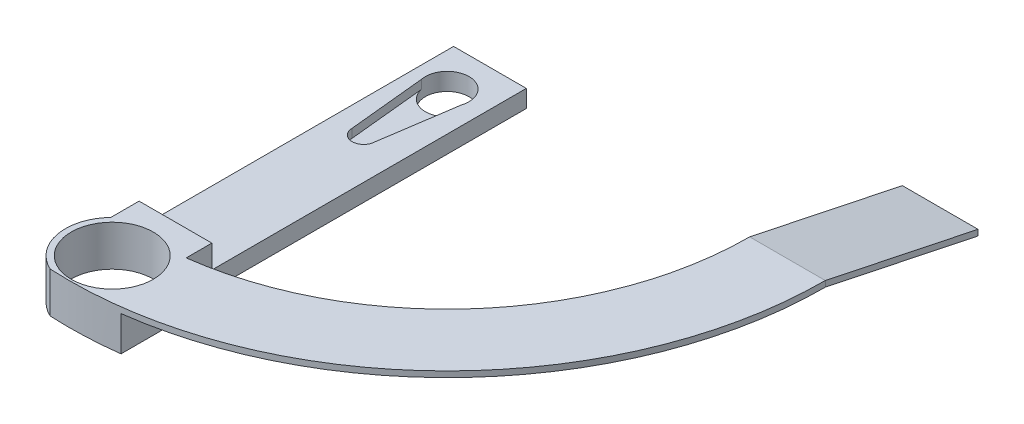
ISO-10303-21;
HEADER;
FILE_DESCRIPTION(('STEP AP214'),'2;1');
FILE_NAME('part.step','',(''),(''),'','','');
FILE_SCHEMA(('AUTOMOTIVE_DESIGN { 1 0 10303 214 1 1 1 1 }'));
ENDSEC;
DATA;
#1=APPLICATION_CONTEXT('core data for automotive mechanical design processes');
#2=APPLICATION_PROTOCOL_DEFINITION('international standard','automotive_design',2000,#1);
#3=PRODUCT_CONTEXT('',#1,'mechanical');
#4=PRODUCT('Part','Part','',(#3));
#5=PRODUCT_RELATED_PRODUCT_CATEGORY('part','',(#4));
#6=PRODUCT_DEFINITION_FORMATION('','',#4);
#7=PRODUCT_DEFINITION_CONTEXT('part definition',#1,'design');
#8=PRODUCT_DEFINITION('design','',#6,#7);
#9=PRODUCT_DEFINITION_SHAPE('','',#8);
#10=(LENGTH_UNIT() NAMED_UNIT(*) SI_UNIT(.MILLI.,.METRE.));
#11=(NAMED_UNIT(*) PLANE_ANGLE_UNIT() SI_UNIT($,.RADIAN.));
#12=(NAMED_UNIT(*) SI_UNIT($,.STERADIAN.) SOLID_ANGLE_UNIT());
#13=UNCERTAINTY_MEASURE_WITH_UNIT(LENGTH_MEASURE(1.E-05),#10,'distance_accuracy_value','');
#14=(GEOMETRIC_REPRESENTATION_CONTEXT(3) GLOBAL_UNCERTAINTY_ASSIGNED_CONTEXT((#13)) GLOBAL_UNIT_ASSIGNED_CONTEXT((#10,
#11,#12)) REPRESENTATION_CONTEXT('',''));
#15=CARTESIAN_POINT('',(0.,0.,0.));
#16=DIRECTION('',(0.,0.,1.));
#17=DIRECTION('',(1.,0.,0.));
#18=AXIS2_PLACEMENT_3D('',#15,#16,#17);
#19=CARTESIAN_POINT('',(0.,3.,0.));
#20=DIRECTION('',(0.,-1.,0.));
#21=DIRECTION('',(0.,0.,-1.));
#22=AXIS2_PLACEMENT_3D('',#19,#20,#21);
#23=PLANE('',#22);
#24=DIRECTION('',(-1.,0.,0.));
#25=VECTOR('',#24,1.);
#26=CARTESIAN_POINT('',(-5.81496405888249,3.,47.1607347172189));
#27=LINE('',#26,#25);
#28=CARTESIAN_POINT('',(6.6930693069307,3.,47.1607347172189));
#29=VERTEX_POINT('',#28);
#30=CARTESIAN_POINT('',(-5.81496405888249,3.,47.1607347172189));
#31=VERTEX_POINT('',#30);
#32=EDGE_CURVE('E217',#29,#31,#27,.T.);
#33=ORIENTED_EDGE('',*,*,#32,.F.);
#34=DIRECTION('',(0.,0.,-1.));
#35=VECTOR('',#34,1.);
#36=CARTESIAN_POINT('',(6.69306930693069,3.,-3.9115659850475));
#37=LINE('',#36,#35);
#38=CARTESIAN_POINT('',(6.69306930693069,3.,-6.9115659850475));
#39=VERTEX_POINT('',#38);
#40=EDGE_CURVE('E245',#29,#39,#37,.T.);
#41=ORIENTED_EDGE('',*,*,#40,.T.);
#42=DIRECTION('',(-1.,0.,0.));
#43=VECTOR('',#42,1.);
#44=CARTESIAN_POINT('',(6.69306930693069,3.,-6.9115659850475));
#45=LINE('',#44,#43);
#46=CARTESIAN_POINT('',(-5.8149640588825,3.,-6.9115659850475));
#47=VERTEX_POINT('',#46);
#48=EDGE_CURVE('E247',#39,#47,#45,.T.);
#49=ORIENTED_EDGE('',*,*,#48,.T.);
#50=DIRECTION('',(0.,0.,1.));
#51=VECTOR('',#50,1.);
#52=CARTESIAN_POINT('',(-5.8149640588825,3.,-6.9115659850475));
#53=LINE('',#52,#51);
#54=EDGE_CURVE('E250',#47,#31,#53,.T.);
#55=ORIENTED_EDGE('',*,*,#54,.T.);
#56=EDGE_LOOP('',(#33,#41,#49,#55));
#57=FACE_BOUND('',#56,.T.);
#58=DIRECTION('',(-0.148340452930244,0.,0.988936352868298));
#59=VECTOR('',#58,1.);
#60=CARTESIAN_POINT('',(3.75,3.,0.));
#61=LINE('',#60,#59);
#62=CARTESIAN_POINT('',(3.58496332518337,3.,1.1002444987775));
#63=VERTEX_POINT('',#62);
#64=CARTESIAN_POINT('',(1.65,3.,14.));
#65=VERTEX_POINT('',#64);
#66=EDGE_CURVE('E184',#63,#65,#61,.T.);
#67=ORIENTED_EDGE('',*,*,#66,.T.);
#68=CARTESIAN_POINT('',(-0.35,3.,14.));
#69=DIRECTION('',(0.,-1.,0.));
#70=DIRECTION('',(0.,0.,-1.));
#71=AXIS2_PLACEMENT_3D('',#68,#69,#70);
#72=CIRCLE('',#71,2.);
#73=CARTESIAN_POINT('',(-2.35,3.,14.));
#74=VERTEX_POINT('',#73);
#75=EDGE_CURVE('E201',#65,#74,#72,.T.);
#76=ORIENTED_EDGE('',*,*,#75,.T.);
#77=DIRECTION('',(-0.0995037190209987,0.,-0.995037190209989));
#78=VECTOR('',#77,1.);
#79=CARTESIAN_POINT('',(-3.75,3.,0.));
#80=LINE('',#79,#78);
#81=CARTESIAN_POINT('',(-3.67574257425743,3.,0.742574257425743));
#82=VERTEX_POINT('',#81);
#83=EDGE_CURVE('E193',#74,#82,#80,.T.);
#84=ORIENTED_EDGE('',*,*,#83,.T.);
#85=CARTESIAN_POINT('',(0.,3.,0.));
#86=DIRECTION('',(0.,1.,0.));
#87=DIRECTION('',(0.,0.,1.));
#88=AXIS2_PLACEMENT_3D('',#85,#86,#87);
#89=CIRCLE('',#88,3.75);
#90=EDGE_CURVE('E209',#63,#82,#89,.T.);
#91=ORIENTED_EDGE('',*,*,#90,.F.);
#92=EDGE_LOOP('',(#67,#76,#84,#91));
#93=FACE_BOUND('',#92,.T.);
#94=ADVANCED_FACE('F33',(#57,#93),#23,.F.);
#95=CARTESIAN_POINT('',(0.,0.,0.));
#96=DIRECTION('',(0.,-1.,0.));
#97=DIRECTION('',(0.,0.,-1.));
#98=AXIS2_PLACEMENT_3D('',#95,#96,#97);
#99=PLANE('',#98);
#100=DIRECTION('',(0.,0.,-1.));
#101=VECTOR('',#100,1.);
#102=CARTESIAN_POINT('',(8.38386432988614,0.,71.0017380547132));
#103=LINE('',#102,#101);
#104=CARTESIAN_POINT('',(8.38386432988614,0.,64.4570463091357));
#105=VERTEX_POINT('',#104);
#106=CARTESIAN_POINT('',(8.38386432988614,0.,51.3196923110229));
#107=VERTEX_POINT('',#106);
#108=EDGE_CURVE('E349',#105,#107,#103,.T.);
#109=ORIENTED_EDGE('',*,*,#108,.F.);
#110=CARTESIAN_POINT('',(0.,0.,0.));
#111=DIRECTION('',(0.,1.,0.));
#112=DIRECTION('',(0.,0.,1.));
#113=AXIS2_PLACEMENT_3D('',#110,#111,#112);
#114=CIRCLE('',#113,65.);
#115=CARTESIAN_POINT('',(-3.35240790305543,0.,64.9134913654437));
#116=VERTEX_POINT('',#115);
#117=EDGE_CURVE('E260',#116,#105,#114,.T.);
#118=ORIENTED_EDGE('',*,*,#117,.F.);
#119=CARTESIAN_POINT('',(0.,0.,57.5931203715617));
#120=DIRECTION('',(0.,1.,0.));
#121=DIRECTION('',(0.,0.,1.));
#122=AXIS2_PLACEMENT_3D('',#119,#120,#121);
#123=CIRCLE('',#122,8.05148869691422);
#124=CARTESIAN_POINT('',(-5.81496405888249,0.,52.0242189331771));
#125=VERTEX_POINT('',#124);
#126=EDGE_CURVE('E257',#125,#116,#123,.T.);
#127=ORIENTED_EDGE('',*,*,#126,.F.);
#128=DIRECTION('',(0.,0.,1.));
#129=VECTOR('',#128,1.);
#130=CARTESIAN_POINT('',(-5.8149640588825,0.,3.0884340149525));
#131=LINE('',#130,#129);
#132=CARTESIAN_POINT('',(-5.8149640588825,0.,-6.9115659850475));
#133=VERTEX_POINT('',#132);
#134=EDGE_CURVE('E255',#133,#125,#131,.T.);
#135=ORIENTED_EDGE('',*,*,#134,.F.);
#136=DIRECTION('',(-1.,0.,0.));
#137=VECTOR('',#136,1.);
#138=CARTESIAN_POINT('',(6.69306930693069,0.,-6.9115659850475));
#139=LINE('',#138,#137);
#140=CARTESIAN_POINT('',(6.69306930693069,0.,-6.9115659850475));
#141=VERTEX_POINT('',#140);
#142=EDGE_CURVE('E244',#141,#133,#139,.T.);
#143=ORIENTED_EDGE('',*,*,#142,.F.);
#144=DIRECTION('',(0.,0.,-1.));
#145=VECTOR('',#144,1.);
#146=CARTESIAN_POINT('',(6.69306930693069,0.,1.48752285452068));
#147=LINE('',#146,#145);
#148=CARTESIAN_POINT('',(6.6930693069307,0.,51.5674589567163));
#149=VERTEX_POINT('',#148);
#150=EDGE_CURVE('E248',#149,#141,#147,.T.);
#151=ORIENTED_EDGE('',*,*,#150,.F.);
#152=CARTESIAN_POINT('',(0.,0.,0.));
#153=DIRECTION('',(0.,-1.,0.));
#154=DIRECTION('',(0.,0.,-1.));
#155=AXIS2_PLACEMENT_3D('',#152,#153,#154);
#156=CIRCLE('',#155,52.);
#157=EDGE_CURVE('E262',#107,#149,#156,.T.);
#158=ORIENTED_EDGE('',*,*,#157,.F.);
#159=EDGE_LOOP('',(#109,#118,#127,#135,#143,#151,#158));
#160=FACE_BOUND('',#159,.T.);
#161=CARTESIAN_POINT('',(0.,0.,0.));
#162=DIRECTION('',(0.,1.,0.));
#163=DIRECTION('',(0.,0.,1.));
#164=AXIS2_PLACEMENT_3D('',#161,#162,#163);
#165=CIRCLE('',#164,3.75);
#166=CARTESIAN_POINT('',(0.,0.,3.75));
#167=VERTEX_POINT('',#166);
#168=EDGE_CURVE('E210',#167,#167,#165,.T.);
#169=ORIENTED_EDGE('',*,*,#168,.T.);
#170=EDGE_LOOP('',(#169));
#171=FACE_BOUND('',#170,.T.);
#172=CARTESIAN_POINT('',(0.,0.,57.5931203715617));
#173=DIRECTION('',(0.,1.,0.));
#174=DIRECTION('',(0.,0.,1.));
#175=AXIS2_PLACEMENT_3D('',#172,#173,#174);
#176=CIRCLE('',#175,7.05148869691422);
#177=CARTESIAN_POINT('',(0.,0.,64.6446090684759));
#178=VERTEX_POINT('',#177);
#179=EDGE_CURVE('E166',#178,#178,#176,.T.);
#180=ORIENTED_EDGE('',*,*,#179,.T.);
#181=EDGE_LOOP('',(#180));
#182=FACE_BOUND('',#181,.T.);
#183=ADVANCED_FACE('F308',(#160,#171,#182),#99,.T.);
#184=CARTESIAN_POINT('',(6.69306930693069,3.,-6.9115659850475));
#185=DIRECTION('',(0.,0.,1.));
#186=DIRECTION('',(1.,0.,0.));
#187=AXIS2_PLACEMENT_3D('',#184,#185,#186);
#188=PLANE('',#187);
#189=ORIENTED_EDGE('',*,*,#142,.T.);
#190=DIRECTION('',(0.,-1.,0.));
#191=VECTOR('',#190,1.);
#192=CARTESIAN_POINT('',(-5.8149640588825,3.,-6.9115659850475));
#193=LINE('',#192,#191);
#194=EDGE_CURVE('E273',#47,#133,#193,.T.);
#195=ORIENTED_EDGE('',*,*,#194,.F.);
#196=ORIENTED_EDGE('',*,*,#48,.F.);
#197=DIRECTION('',(0.,-1.,0.));
#198=VECTOR('',#197,1.);
#199=CARTESIAN_POINT('',(6.69306930693069,3.,-6.9115659850475));
#200=LINE('',#199,#198);
#201=EDGE_CURVE('E276',#39,#141,#200,.T.);
#202=ORIENTED_EDGE('',*,*,#201,.T.);
#203=EDGE_LOOP('',(#189,#195,#196,#202));
#204=FACE_BOUND('',#203,.T.);
#205=ADVANCED_FACE('F35',(#204),#188,.F.);
#206=CARTESIAN_POINT('',(-5.8149640588825,3.,3.0884340149525));
#207=DIRECTION('',(1.,0.,0.));
#208=DIRECTION('',(0.,0.,-1.));
#209=AXIS2_PLACEMENT_3D('',#206,#207,#208);
#210=PLANE('',#209);
#211=ORIENTED_EDGE('',*,*,#134,.T.);
#212=DIRECTION('',(0.,-1.,0.));
#213=VECTOR('',#212,1.);
#214=CARTESIAN_POINT('',(-5.81496405888249,3.,52.0242189331771));
#215=LINE('',#214,#213);
#216=CARTESIAN_POINT('',(-5.81496405888248,7.,52.0242189331771));
#217=VERTEX_POINT('',#216);
#218=EDGE_CURVE('E270',#217,#125,#215,.T.);
#219=ORIENTED_EDGE('',*,*,#218,.F.);
#220=DIRECTION('',(0.,0.,1.));
#221=VECTOR('',#220,1.);
#222=CARTESIAN_POINT('',(-5.81496405888249,7.,47.1607347172189));
#223=LINE('',#222,#221);
#224=CARTESIAN_POINT('',(-5.81496405888249,7.,47.1607347172189));
#225=VERTEX_POINT('',#224);
#226=EDGE_CURVE('E227',#225,#217,#223,.T.);
#227=ORIENTED_EDGE('',*,*,#226,.F.);
#228=DIRECTION('',(0.,-1.,0.));
#229=VECTOR('',#228,1.);
#230=CARTESIAN_POINT('',(-5.81496405888249,7.,47.1607347172189));
#231=LINE('',#230,#229);
#232=EDGE_CURVE('E233',#225,#31,#231,.T.);
#233=ORIENTED_EDGE('',*,*,#232,.T.);
#234=ORIENTED_EDGE('',*,*,#54,.F.);
#235=ORIENTED_EDGE('',*,*,#194,.T.);
#236=EDGE_LOOP('',(#211,#219,#227,#233,#234,#235));
#237=FACE_BOUND('',#236,.T.);
#238=ADVANCED_FACE('F332',(#237),#210,.F.);
#239=CARTESIAN_POINT('',(0.,3.,57.5931203715617));
#240=DIRECTION('',(0.,-1.,0.));
#241=DIRECTION('',(0.,0.,-1.));
#242=AXIS2_PLACEMENT_3D('',#239,#240,#241);
#243=CYLINDRICAL_SURFACE('',#242,8.05148869691422);
#244=ORIENTED_EDGE('',*,*,#126,.T.);
#245=DIRECTION('',(0.,-1.,0.));
#246=VECTOR('',#245,1.);
#247=CARTESIAN_POINT('',(-3.35240790305543,3.,64.9134913654437));
#248=LINE('',#247,#246);
#249=CARTESIAN_POINT('',(-3.35240790305546,7.,64.9134913654437));
#250=VERTEX_POINT('',#249);
#251=EDGE_CURVE('E267',#250,#116,#248,.T.);
#252=ORIENTED_EDGE('',*,*,#251,.F.);
#253=CARTESIAN_POINT('',(0.,7.,57.5931203715617));
#254=DIRECTION('',(0.,1.,0.));
#255=DIRECTION('',(0.,0.,1.));
#256=AXIS2_PLACEMENT_3D('',#253,#254,#255);
#257=CIRCLE('',#256,8.05148869691421);
#258=EDGE_CURVE('E230',#217,#250,#257,.T.);
#259=ORIENTED_EDGE('',*,*,#258,.F.);
#260=ORIENTED_EDGE('',*,*,#218,.T.);
#261=EDGE_LOOP('',(#244,#252,#259,#260));
#262=FACE_BOUND('',#261,.T.);
#263=ADVANCED_FACE('F330',(#262),#243,.T.);
#264=CARTESIAN_POINT('',(0.,3.,0.));
#265=DIRECTION('',(0.,-1.,0.));
#266=DIRECTION('',(0.,0.,-1.));
#267=AXIS2_PLACEMENT_3D('',#264,#265,#266);
#268=CYLINDRICAL_SURFACE('',#267,65.);
#269=ORIENTED_EDGE('',*,*,#117,.T.);
#270=DIRECTION('',(0.,-1.,0.));
#271=VECTOR('',#270,1.);
#272=CARTESIAN_POINT('',(8.38386432988614,3.,64.4570463091357));
#273=LINE('',#272,#271);
#274=CARTESIAN_POINT('',(8.38386432988614,6.,64.4570463091357));
#275=VERTEX_POINT('',#274);
#276=EDGE_CURVE('E182',#105,#275,#273,.F.);
#277=ORIENTED_EDGE('',*,*,#276,.T.);
#278=CARTESIAN_POINT('',(0.,6.,0.));
#279=DIRECTION('',(0.,-1.,0.));
#280=DIRECTION('',(0.,0.,-1.));
#281=AXIS2_PLACEMENT_3D('',#278,#279,#280);
#282=CIRCLE('',#281,65.);
#283=CARTESIAN_POINT('',(65.,6.,0.));
#284=VERTEX_POINT('',#283);
#285=EDGE_CURVE('E173',#284,#275,#282,.T.);
#286=ORIENTED_EDGE('',*,*,#285,.F.);
#287=DIRECTION('',(0.,-1.,0.));
#288=VECTOR('',#287,1.);
#289=CARTESIAN_POINT('',(65.,7.,0.));
#290=LINE('',#289,#288);
#291=CARTESIAN_POINT('',(65.,7.,0.));
#292=VERTEX_POINT('',#291);
#293=EDGE_CURVE('E160',#292,#284,#290,.T.);
#294=ORIENTED_EDGE('',*,*,#293,.F.);
#295=CARTESIAN_POINT('',(0.,7.,0.));
#296=DIRECTION('',(0.,1.,0.));
#297=DIRECTION('',(0.,0.,1.));
#298=AXIS2_PLACEMENT_3D('',#295,#296,#297);
#299=CIRCLE('',#298,65.);
#300=EDGE_CURVE('E218',#250,#292,#299,.T.);
#301=ORIENTED_EDGE('',*,*,#300,.F.);
#302=ORIENTED_EDGE('',*,*,#251,.T.);
#303=EDGE_LOOP('',(#269,#277,#286,#294,#301,#302));
#304=FACE_BOUND('',#303,.T.);
#305=ADVANCED_FACE('F181',(#304),#268,.T.);
#306=CARTESIAN_POINT('',(0.,3.,0.));
#307=DIRECTION('',(0.,-1.,0.));
#308=DIRECTION('',(0.,0.,-1.));
#309=AXIS2_PLACEMENT_3D('',#306,#307,#308);
#310=CYLINDRICAL_SURFACE('',#309,52.);
#311=CARTESIAN_POINT('',(0.,6.,0.));
#312=DIRECTION('',(0.,-1.,0.));
#313=DIRECTION('',(0.,0.,-1.));
#314=AXIS2_PLACEMENT_3D('',#311,#312,#313);
#315=CIRCLE('',#314,52.);
#316=CARTESIAN_POINT('',(8.38386432988614,6.,51.3196923110229));
#317=VERTEX_POINT('',#316);
#318=CARTESIAN_POINT('',(52.,6.,0.));
#319=VERTEX_POINT('',#318);
#320=EDGE_CURVE('E176',#317,#319,#315,.F.);
#321=ORIENTED_EDGE('',*,*,#320,.F.);
#322=DIRECTION('',(0.,-1.,0.));
#323=VECTOR('',#322,1.);
#324=CARTESIAN_POINT('',(8.38386432988614,3.,51.3196923110229));
#325=LINE('',#324,#323);
#326=EDGE_CURVE('E11',#317,#107,#325,.T.);
#327=ORIENTED_EDGE('',*,*,#326,.T.);
#328=ORIENTED_EDGE('',*,*,#157,.T.);
#329=DIRECTION('',(0.,-1.,0.));
#330=VECTOR('',#329,1.);
#331=CARTESIAN_POINT('',(6.6930693069307,3.,51.5674589567163));
#332=LINE('',#331,#330);
#333=CARTESIAN_POINT('',(6.6930693069307,7.,51.5674589567163));
#334=VERTEX_POINT('',#333);
#335=EDGE_CURVE('E252',#334,#149,#332,.T.);
#336=ORIENTED_EDGE('',*,*,#335,.F.);
#337=CARTESIAN_POINT('',(0.,7.,0.));
#338=DIRECTION('',(0.,-1.,0.));
#339=DIRECTION('',(0.,0.,1.));
#340=AXIS2_PLACEMENT_3D('',#337,#338,#339);
#341=CIRCLE('',#340,52.);
#342=CARTESIAN_POINT('',(52.,7.,0.));
#343=VERTEX_POINT('',#342);
#344=EDGE_CURVE('E220',#343,#334,#341,.T.);
#345=ORIENTED_EDGE('',*,*,#344,.F.);
#346=DIRECTION('',(0.,-1.,0.));
#347=VECTOR('',#346,1.);
#348=CARTESIAN_POINT('',(52.,7.,0.));
#349=LINE('',#348,#347);
#350=EDGE_CURVE('E167',#343,#319,#349,.T.);
#351=ORIENTED_EDGE('',*,*,#350,.T.);
#352=EDGE_LOOP('',(#321,#327,#328,#336,#345,#351));
#353=FACE_BOUND('',#352,.T.);
#354=ADVANCED_FACE('F323',(#353),#310,.F.);
#355=CARTESIAN_POINT('',(6.69306930693069,3.,1.48752285452068));
#356=DIRECTION('',(-1.,0.,0.));
#357=DIRECTION('',(0.,0.,1.));
#358=AXIS2_PLACEMENT_3D('',#355,#356,#357);
#359=PLANE('',#358);
#360=ORIENTED_EDGE('',*,*,#150,.T.);
#361=ORIENTED_EDGE('',*,*,#201,.F.);
#362=ORIENTED_EDGE('',*,*,#40,.F.);
#363=DIRECTION('',(0.,-1.,0.));
#364=VECTOR('',#363,1.);
#365=CARTESIAN_POINT('',(6.6930693069307,7.,47.1607347172189));
#366=LINE('',#365,#364);
#367=CARTESIAN_POINT('',(6.6930693069307,7.,47.1607347172189));
#368=VERTEX_POINT('',#367);
#369=EDGE_CURVE('E238',#368,#29,#366,.T.);
#370=ORIENTED_EDGE('',*,*,#369,.F.);
#371=DIRECTION('',(0.,0.,-1.));
#372=VECTOR('',#371,1.);
#373=CARTESIAN_POINT('',(6.6930693069307,7.,47.1607347172189));
#374=LINE('',#373,#372);
#375=EDGE_CURVE('E223',#334,#368,#374,.T.);
#376=ORIENTED_EDGE('',*,*,#375,.F.);
#377=ORIENTED_EDGE('',*,*,#335,.T.);
#378=EDGE_LOOP('',(#360,#361,#362,#370,#376,#377));
#379=FACE_BOUND('',#378,.T.);
#380=ADVANCED_FACE('F320',(#379),#359,.F.);
#381=CARTESIAN_POINT('',(0.,3.,57.5931203715617));
#382=DIRECTION('',(0.,-1.,0.));
#383=DIRECTION('',(0.,0.,-1.));
#384=AXIS2_PLACEMENT_3D('',#381,#382,#383);
#385=CYLINDRICAL_SURFACE('',#384,7.05148869691422);
#386=ORIENTED_EDGE('',*,*,#179,.F.);
#387=EDGE_LOOP('',(#386));
#388=FACE_BOUND('',#387,.T.);
#389=CARTESIAN_POINT('',(0.,7.,57.5931203715617));
#390=DIRECTION('',(0.,1.,0.));
#391=DIRECTION('',(0.,0.,1.));
#392=AXIS2_PLACEMENT_3D('',#389,#390,#391);
#393=CIRCLE('',#392,7.05148869691422);
#394=CARTESIAN_POINT('',(0.,7.,64.6446090684759));
#395=VERTEX_POINT('',#394);
#396=EDGE_CURVE('E213',#395,#395,#393,.T.);
#397=ORIENTED_EDGE('',*,*,#396,.T.);
#398=EDGE_LOOP('',(#397));
#399=FACE_BOUND('',#398,.T.);
#400=ADVANCED_FACE('F317',(#388,#399),#385,.F.);
#401=CARTESIAN_POINT('',(0.,7.,0.));
#402=DIRECTION('',(0.,1.,0.));
#403=DIRECTION('',(0.,0.,1.));
#404=AXIS2_PLACEMENT_3D('',#401,#402,#403);
#405=PLANE('',#404);
#406=DIRECTION('',(-1.,0.,0.));
#407=VECTOR('',#406,1.);
#408=CARTESIAN_POINT('',(65.,7.,0.));
#409=LINE('',#408,#407);
#410=EDGE_CURVE('E365',#292,#343,#409,.T.);
#411=ORIENTED_EDGE('',*,*,#410,.T.);
#412=ORIENTED_EDGE('',*,*,#344,.T.);
#413=ORIENTED_EDGE('',*,*,#375,.T.);
#414=DIRECTION('',(-1.,0.,0.));
#415=VECTOR('',#414,1.);
#416=CARTESIAN_POINT('',(-5.81496405888249,7.,47.1607347172189));
#417=LINE('',#416,#415);
#418=EDGE_CURVE('E225',#368,#225,#417,.T.);
#419=ORIENTED_EDGE('',*,*,#418,.T.);
#420=ORIENTED_EDGE('',*,*,#226,.T.);
#421=ORIENTED_EDGE('',*,*,#258,.T.);
#422=ORIENTED_EDGE('',*,*,#300,.T.);
#423=EDGE_LOOP('',(#411,#412,#413,#419,#420,#421,#422));
#424=FACE_BOUND('',#423,.T.);
#425=ORIENTED_EDGE('',*,*,#396,.F.);
#426=EDGE_LOOP('',(#425));
#427=FACE_BOUND('',#426,.T.);
#428=ADVANCED_FACE('F352',(#424,#427),#405,.T.);
#429=CARTESIAN_POINT('',(-5.81496405888249,7.,47.1607347172189));
#430=DIRECTION('',(0.,0.,1.));
#431=DIRECTION('',(1.,0.,0.));
#432=AXIS2_PLACEMENT_3D('',#429,#430,#431);
#433=PLANE('',#432);
#434=ORIENTED_EDGE('',*,*,#32,.T.);
#435=ORIENTED_EDGE('',*,*,#232,.F.);
#436=ORIENTED_EDGE('',*,*,#418,.F.);
#437=ORIENTED_EDGE('',*,*,#369,.T.);
#438=EDGE_LOOP('',(#434,#435,#436,#437));
#439=FACE_BOUND('',#438,.T.);
#440=ADVANCED_FACE('F357',(#439),#433,.F.);
#441=CARTESIAN_POINT('',(0.,0.,0.));
#442=DIRECTION('',(0.,1.,0.));
#443=DIRECTION('',(0.,0.,1.));
#444=AXIS2_PLACEMENT_3D('',#441,#442,#443);
#445=CYLINDRICAL_SURFACE('',#444,3.75);
#446=ORIENTED_EDGE('',*,*,#90,.T.);
#447=DIRECTION('',(0.,1.,0.));
#448=VECTOR('',#447,1.);
#449=CARTESIAN_POINT('',(-3.67574257425742,0.,0.742574257425752));
#450=LINE('',#449,#448);
#451=CARTESIAN_POINT('',(-3.67574257425743,1.5,0.742574257425743));
#452=VERTEX_POINT('',#451);
#453=EDGE_CURVE('E282',#452,#82,#450,.T.);
#454=ORIENTED_EDGE('',*,*,#453,.F.);
#455=CARTESIAN_POINT('',(0.,1.5,0.));
#456=DIRECTION('',(0.,-1.,0.));
#457=DIRECTION('',(0.,0.,-1.));
#458=AXIS2_PLACEMENT_3D('',#455,#456,#457);
#459=CIRCLE('',#458,3.75);
#460=CARTESIAN_POINT('',(3.58496332518337,1.5,1.1002444987775));
#461=VERTEX_POINT('',#460);
#462=EDGE_CURVE('E279',#452,#461,#459,.F.);
#463=ORIENTED_EDGE('',*,*,#462,.T.);
#464=DIRECTION('',(0.,1.,0.));
#465=VECTOR('',#464,1.);
#466=CARTESIAN_POINT('',(3.58496332518338,0.,1.1002444987775));
#467=LINE('',#466,#465);
#468=EDGE_CURVE('E178',#63,#461,#467,.F.);
#469=ORIENTED_EDGE('',*,*,#468,.F.);
#470=EDGE_LOOP('',(#446,#454,#463,#469));
#471=FACE_BOUND('',#470,.T.);
#472=ORIENTED_EDGE('',*,*,#168,.F.);
#473=EDGE_LOOP('',(#472));
#474=FACE_BOUND('',#473,.T.);
#475=ADVANCED_FACE('F293',(#471,#474),#445,.F.);
#476=CARTESIAN_POINT('',(3.75,1.5,0.));
#477=DIRECTION('',(-0.988936352868298,0.,-0.148340452930244));
#478=DIRECTION('',(-0.148340452930244,0.,0.988936352868298));
#479=AXIS2_PLACEMENT_3D('',#476,#477,#478);
#480=PLANE('',#479);
#481=ORIENTED_EDGE('',*,*,#468,.T.);
#482=DIRECTION('',(-0.148340452930244,0.,0.988936352868298));
#483=VECTOR('',#482,1.);
#484=CARTESIAN_POINT('',(3.75,1.5,0.));
#485=LINE('',#484,#483);
#486=CARTESIAN_POINT('',(1.65,1.5,14.));
#487=VERTEX_POINT('',#486);
#488=EDGE_CURVE('E190',#461,#487,#485,.T.);
#489=ORIENTED_EDGE('',*,*,#488,.T.);
#490=DIRECTION('',(0.,1.,0.));
#491=VECTOR('',#490,1.);
#492=CARTESIAN_POINT('',(1.65,1.5,14.));
#493=LINE('',#492,#491);
#494=EDGE_CURVE('E207',#487,#65,#493,.T.);
#495=ORIENTED_EDGE('',*,*,#494,.T.);
#496=ORIENTED_EDGE('',*,*,#66,.F.);
#497=EDGE_LOOP('',(#481,#489,#495,#496));
#498=FACE_BOUND('',#497,.T.);
#499=ADVANCED_FACE('F288',(#498),#480,.T.);
#500=CARTESIAN_POINT('',(-3.75,1.5,0.));
#501=DIRECTION('',(0.995037190209989,0.,-0.0995037190209987));
#502=DIRECTION('',(-0.0995037190209987,0.,-0.995037190209989));
#503=AXIS2_PLACEMENT_3D('',#500,#501,#502);
#504=PLANE('',#503);
#505=ORIENTED_EDGE('',*,*,#453,.T.);
#506=ORIENTED_EDGE('',*,*,#83,.F.);
#507=DIRECTION('',(0.,1.,0.));
#508=VECTOR('',#507,1.);
#509=CARTESIAN_POINT('',(-2.35,1.5,14.));
#510=LINE('',#509,#508);
#511=CARTESIAN_POINT('',(-2.35,1.5,14.));
#512=VERTEX_POINT('',#511);
#513=EDGE_CURVE('E198',#512,#74,#510,.T.);
#514=ORIENTED_EDGE('',*,*,#513,.F.);
#515=DIRECTION('',(-0.0995037190209987,0.,-0.995037190209989));
#516=VECTOR('',#515,1.);
#517=CARTESIAN_POINT('',(-3.75,1.5,0.));
#518=LINE('',#517,#516);
#519=EDGE_CURVE('E195',#512,#452,#518,.T.);
#520=ORIENTED_EDGE('',*,*,#519,.T.);
#521=EDGE_LOOP('',(#505,#506,#514,#520));
#522=FACE_BOUND('',#521,.T.);
#523=ADVANCED_FACE('F301',(#522),#504,.T.);
#524=CARTESIAN_POINT('',(0.,1.5,0.));
#525=DIRECTION('',(0.,-1.,0.));
#526=DIRECTION('',(0.,0.,-1.));
#527=AXIS2_PLACEMENT_3D('',#524,#525,#526);
#528=PLANE('',#527);
#529=ORIENTED_EDGE('',*,*,#519,.F.);
#530=CARTESIAN_POINT('',(-0.35,1.5,14.));
#531=DIRECTION('',(0.,-1.,0.));
#532=DIRECTION('',(0.,0.,-1.));
#533=AXIS2_PLACEMENT_3D('',#530,#531,#532);
#534=CIRCLE('',#533,2.);
#535=EDGE_CURVE('E192',#487,#512,#534,.T.);
#536=ORIENTED_EDGE('',*,*,#535,.F.);
#537=ORIENTED_EDGE('',*,*,#488,.F.);
#538=ORIENTED_EDGE('',*,*,#462,.F.);
#539=EDGE_LOOP('',(#529,#536,#537,#538));
#540=FACE_BOUND('',#539,.T.);
#541=ADVANCED_FACE('F297',(#540),#528,.F.);
#542=CARTESIAN_POINT('',(-0.35,1.5,14.));
#543=DIRECTION('',(0.,1.,0.));
#544=DIRECTION('',(0.,0.,1.));
#545=AXIS2_PLACEMENT_3D('',#542,#543,#544);
#546=CYLINDRICAL_SURFACE('',#545,2.);
#547=ORIENTED_EDGE('',*,*,#75,.F.);
#548=ORIENTED_EDGE('',*,*,#494,.F.);
#549=ORIENTED_EDGE('',*,*,#535,.T.);
#550=ORIENTED_EDGE('',*,*,#513,.T.);
#551=EDGE_LOOP('',(#547,#548,#549,#550));
#552=FACE_BOUND('',#551,.T.);
#553=ADVANCED_FACE('F305',(#552),#546,.F.);
#554=CARTESIAN_POINT('',(8.38386432988614,6.,71.0017380547132));
#555=DIRECTION('',(-1.,0.,0.));
#556=DIRECTION('',(0.,0.,1.));
#557=AXIS2_PLACEMENT_3D('',#554,#555,#556);
#558=PLANE('',#557);
#559=ORIENTED_EDGE('',*,*,#108,.T.);
#560=ORIENTED_EDGE('',*,*,#326,.F.);
#561=DIRECTION('',(0.,0.,-1.));
#562=VECTOR('',#561,1.);
#563=CARTESIAN_POINT('',(8.38386432988614,6.,71.0017380547132));
#564=LINE('',#563,#562);
#565=EDGE_CURVE('E186',#275,#317,#564,.T.);
#566=ORIENTED_EDGE('',*,*,#565,.F.);
#567=ORIENTED_EDGE('',*,*,#276,.F.);
#568=EDGE_LOOP('',(#559,#560,#566,#567));
#569=FACE_BOUND('',#568,.T.);
#570=ADVANCED_FACE('F386',(#569),#558,.F.);
#571=CARTESIAN_POINT('',(0.,6.,0.));
#572=DIRECTION('',(0.,-1.,0.));
#573=DIRECTION('',(0.,0.,-1.));
#574=AXIS2_PLACEMENT_3D('',#571,#572,#573);
#575=PLANE('',#574);
#576=ORIENTED_EDGE('',*,*,#285,.T.);
#577=ORIENTED_EDGE('',*,*,#565,.T.);
#578=ORIENTED_EDGE('',*,*,#320,.T.);
#579=DIRECTION('',(1.,0.,0.));
#580=VECTOR('',#579,1.);
#581=CARTESIAN_POINT('',(65.,6.,0.));
#582=LINE('',#581,#580);
#583=EDGE_CURVE('E41',#319,#284,#582,.T.);
#584=ORIENTED_EDGE('',*,*,#583,.T.);
#585=EDGE_LOOP('',(#576,#577,#578,#584));
#586=FACE_BOUND('',#585,.T.);
#587=ADVANCED_FACE('F171',(#586),#575,.T.);
#588=CARTESIAN_POINT('',(52.,7.,0.));
#589=DIRECTION('',(-1.,0.,0.));
#590=DIRECTION('',(0.,0.,1.));
#591=AXIS2_PLACEMENT_3D('',#588,#589,#590);
#592=PLANE('',#591);
#593=DIRECTION('',(0.,-0.204987644478739,-0.978764560867964));
#594=VECTOR('',#593,1.);
#595=CARTESIAN_POINT('',(52.,0.5,-26.2611197785247));
#596=LINE('',#595,#594);
#597=CARTESIAN_POINT('',(52.,0.5,-26.2611197785247));
#598=VERTEX_POINT('',#597);
#599=EDGE_CURVE('E48',#319,#598,#596,.T.);
#600=ORIENTED_EDGE('',*,*,#599,.F.);
#601=ORIENTED_EDGE('',*,*,#350,.F.);
#602=DIRECTION('',(0.,0.204987644478739,0.978764560867964));
#603=VECTOR('',#602,1.);
#604=CARTESIAN_POINT('',(52.,7.,0.));
#605=LINE('',#604,#603);
#606=CARTESIAN_POINT('',(52.,1.5,-26.2611197785247));
#607=VERTEX_POINT('',#606);
#608=EDGE_CURVE('E371',#607,#343,#605,.T.);
#609=ORIENTED_EDGE('',*,*,#608,.F.);
#610=DIRECTION('',(0.,-1.,0.));
#611=VECTOR('',#610,1.);
#612=CARTESIAN_POINT('',(52.,7.,-26.2611197785247));
#613=LINE('',#612,#611);
#614=EDGE_CURVE('E373',#607,#598,#613,.T.);
#615=ORIENTED_EDGE('',*,*,#614,.T.);
#616=EDGE_LOOP('',(#600,#601,#609,#615));
#617=FACE_BOUND('',#616,.T.);
#618=ADVANCED_FACE('F369',(#617),#592,.T.);
#619=CARTESIAN_POINT('',(65.,7.,0.));
#620=DIRECTION('',(1.,0.,0.));
#621=DIRECTION('',(0.,0.,-1.));
#622=AXIS2_PLACEMENT_3D('',#619,#620,#621);
#623=PLANE('',#622);
#624=DIRECTION('',(0.,-0.204987644478739,-0.978764560867964));
#625=VECTOR('',#624,1.);
#626=CARTESIAN_POINT('',(65.,0.5,-26.2611197785247));
#627=LINE('',#626,#625);
#628=CARTESIAN_POINT('',(65.,0.5,-26.2611197785247));
#629=VERTEX_POINT('',#628);
#630=EDGE_CURVE('E150',#284,#629,#627,.T.);
#631=ORIENTED_EDGE('',*,*,#630,.T.);
#632=DIRECTION('',(0.,-1.,0.));
#633=VECTOR('',#632,1.);
#634=CARTESIAN_POINT('',(65.,7.,-26.2611197785247));
#635=LINE('',#634,#633);
#636=CARTESIAN_POINT('',(65.,1.5,-26.2611197785247));
#637=VERTEX_POINT('',#636);
#638=EDGE_CURVE('E382',#637,#629,#635,.T.);
#639=ORIENTED_EDGE('',*,*,#638,.F.);
#640=DIRECTION('',(0.,0.204987644478739,0.978764560867964));
#641=VECTOR('',#640,1.);
#642=CARTESIAN_POINT('',(65.,7.,0.));
#643=LINE('',#642,#641);
#644=EDGE_CURVE('E56',#637,#292,#643,.T.);
#645=ORIENTED_EDGE('',*,*,#644,.T.);
#646=ORIENTED_EDGE('',*,*,#293,.T.);
#647=EDGE_LOOP('',(#631,#639,#645,#646));
#648=FACE_BOUND('',#647,.T.);
#649=ADVANCED_FACE('F161',(#648),#623,.T.);
#650=CARTESIAN_POINT('',(52.,7.,-26.2611197785247));
#651=DIRECTION('',(0.,0.,-1.));
#652=DIRECTION('',(-1.,0.,0.));
#653=AXIS2_PLACEMENT_3D('',#650,#651,#652);
#654=PLANE('',#653);
#655=DIRECTION('',(-1.,0.,0.));
#656=VECTOR('',#655,1.);
#657=CARTESIAN_POINT('',(65.,0.5,-26.2611197785247));
#658=LINE('',#657,#656);
#659=EDGE_CURVE('E154',#629,#598,#658,.T.);
#660=ORIENTED_EDGE('',*,*,#659,.T.);
#661=ORIENTED_EDGE('',*,*,#614,.F.);
#662=DIRECTION('',(-1.,0.,0.));
#663=VECTOR('',#662,1.);
#664=CARTESIAN_POINT('',(65.,1.5,-26.2611197785247));
#665=LINE('',#664,#663);
#666=EDGE_CURVE('E378',#637,#607,#665,.T.);
#667=ORIENTED_EDGE('',*,*,#666,.F.);
#668=ORIENTED_EDGE('',*,*,#638,.T.);
#669=EDGE_LOOP('',(#660,#661,#667,#668));
#670=FACE_BOUND('',#669,.T.);
#671=ADVANCED_FACE('F486',(#670),#654,.T.);
#672=CARTESIAN_POINT('',(65.,7.,0.));
#673=DIRECTION('',(0.,-0.978764560867964,0.204987644478739));
#674=DIRECTION('',(0.,-0.204987644478739,-0.978764560867964));
#675=AXIS2_PLACEMENT_3D('',#672,#673,#674);
#676=PLANE('',#675);
#677=ORIENTED_EDGE('',*,*,#608,.T.);
#678=ORIENTED_EDGE('',*,*,#410,.F.);
#679=ORIENTED_EDGE('',*,*,#644,.F.);
#680=ORIENTED_EDGE('',*,*,#666,.T.);
#681=EDGE_LOOP('',(#677,#678,#679,#680));
#682=FACE_BOUND('',#681,.T.);
#683=ADVANCED_FACE('F495',(#682),#676,.F.);
#684=CARTESIAN_POINT('',(65.,0.5,-26.2611197785247));
#685=DIRECTION('',(0.,0.978764560867964,-0.204987644478739));
#686=DIRECTION('',(0.,0.204987644478739,0.978764560867964));
#687=AXIS2_PLACEMENT_3D('',#684,#685,#686);
#688=PLANE('',#687);
#689=ORIENTED_EDGE('',*,*,#599,.T.);
#690=ORIENTED_EDGE('',*,*,#659,.F.);
#691=ORIENTED_EDGE('',*,*,#630,.F.);
#692=ORIENTED_EDGE('',*,*,#583,.F.);
#693=EDGE_LOOP('',(#689,#690,#691,#692));
#694=FACE_BOUND('',#693,.T.);
#695=ADVANCED_FACE('F152',(#694),#688,.F.);
#696=CLOSED_SHELL('',(#94,#183,#205,#238,#263,#305,#354,#380,#400,#428,#440,#475,#499,#523,#541,
#553,#570,#587,#618,#649,#671,#683,#695));
#697=MANIFOLD_SOLID_BREP('B2',#696);
#698=ADVANCED_BREP_SHAPE_REPRESENTATION('',(#18,#697),#14);
#699=SHAPE_DEFINITION_REPRESENTATION(#9,#698);
ENDSEC;
END-ISO-10303-21;
